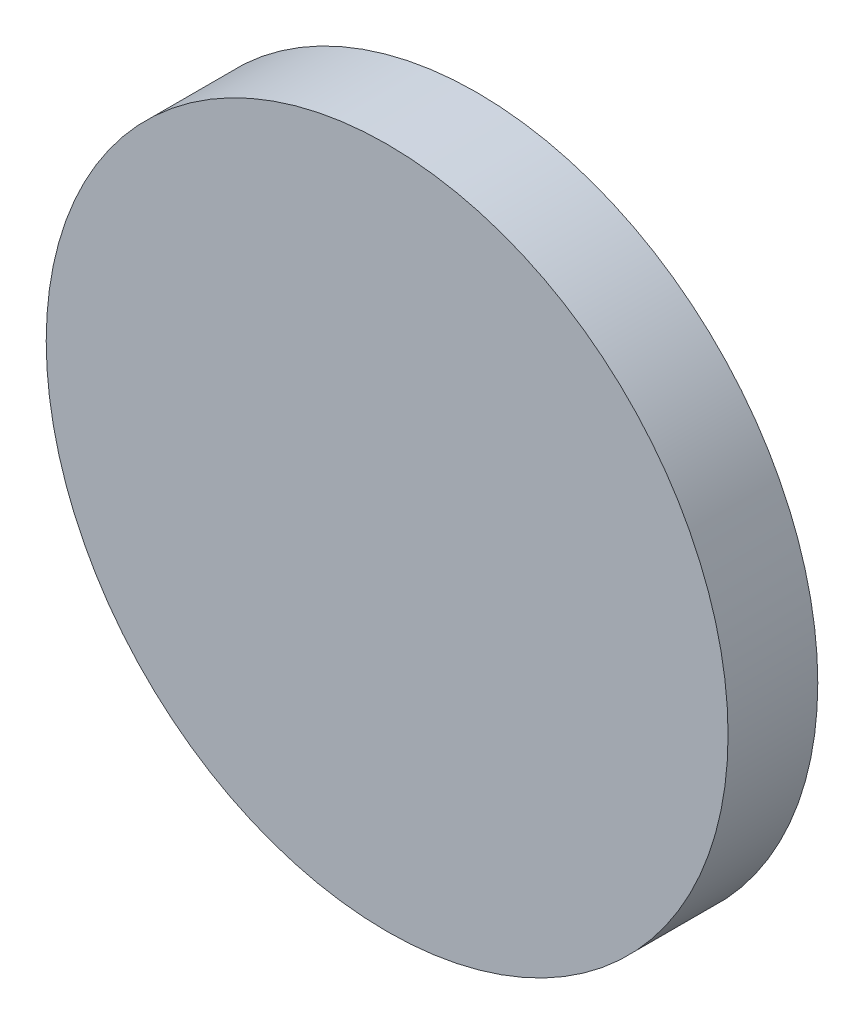
ISO-10303-21;
HEADER;
FILE_DESCRIPTION(('STEP AP214'),'2;1');
FILE_NAME('part.step','',(''),(''),'','','');
FILE_SCHEMA(('AUTOMOTIVE_DESIGN { 1 0 10303 214 1 1 1 1 }'));
ENDSEC;
DATA;
#1=APPLICATION_CONTEXT('core data for automotive mechanical design processes');
#2=APPLICATION_PROTOCOL_DEFINITION('international standard','automotive_design',2000,#1);
#3=PRODUCT_CONTEXT('',#1,'mechanical');
#4=PRODUCT('Part','Part','',(#3));
#5=PRODUCT_RELATED_PRODUCT_CATEGORY('part','',(#4));
#6=PRODUCT_DEFINITION_FORMATION('','',#4);
#7=PRODUCT_DEFINITION_CONTEXT('part definition',#1,'design');
#8=PRODUCT_DEFINITION('design','',#6,#7);
#9=PRODUCT_DEFINITION_SHAPE('','',#8);
#10=(LENGTH_UNIT() NAMED_UNIT(*) SI_UNIT(.MILLI.,.METRE.));
#11=(NAMED_UNIT(*) PLANE_ANGLE_UNIT() SI_UNIT($,.RADIAN.));
#12=(NAMED_UNIT(*) SI_UNIT($,.STERADIAN.) SOLID_ANGLE_UNIT());
#13=UNCERTAINTY_MEASURE_WITH_UNIT(LENGTH_MEASURE(1.E-05),#10,'distance_accuracy_value','');
#14=(GEOMETRIC_REPRESENTATION_CONTEXT(3) GLOBAL_UNCERTAINTY_ASSIGNED_CONTEXT((#13)) GLOBAL_UNIT_ASSIGNED_CONTEXT((#10,
#11,#12)) REPRESENTATION_CONTEXT('',''));
#15=CARTESIAN_POINT('',(0.,0.,0.));
#16=DIRECTION('',(0.,0.,1.));
#17=DIRECTION('',(1.,0.,0.));
#18=AXIS2_PLACEMENT_3D('',#15,#16,#17);
#19=CARTESIAN_POINT('',(0.,0.,5.));
#20=DIRECTION('',(0.,0.,-1.));
#21=DIRECTION('',(-1.,0.,0.));
#22=AXIS2_PLACEMENT_3D('',#19,#20,#21);
#23=CYLINDRICAL_SURFACE('',#22,19.);
#24=CARTESIAN_POINT('',(0.,0.,5.));
#25=DIRECTION('',(0.,0.,1.));
#26=DIRECTION('',(1.,0.,0.));
#27=AXIS2_PLACEMENT_3D('',#24,#25,#26);
#28=CIRCLE('',#27,19.);
#29=CARTESIAN_POINT('',(19.,0.,5.));
#30=VERTEX_POINT('',#29);
#31=EDGE_CURVE('E10',#30,#30,#28,.T.);
#32=ORIENTED_EDGE('',*,*,#31,.F.);
#33=EDGE_LOOP('',(#32));
#34=FACE_BOUND('',#33,.T.);
#35=CARTESIAN_POINT('',(0.,0.,0.));
#36=DIRECTION('',(0.,0.,1.));
#37=DIRECTION('',(1.,0.,0.));
#38=AXIS2_PLACEMENT_3D('',#35,#36,#37);
#39=CIRCLE('',#38,19.);
#40=CARTESIAN_POINT('',(19.,0.,0.));
#41=VERTEX_POINT('',#40);
#42=EDGE_CURVE('E38',#41,#41,#39,.T.);
#43=ORIENTED_EDGE('',*,*,#42,.T.);
#44=EDGE_LOOP('',(#43));
#45=FACE_BOUND('',#44,.T.);
#46=ADVANCED_FACE('F35',(#34,#45),#23,.T.);
#47=CARTESIAN_POINT('',(0.,0.,5.));
#48=DIRECTION('',(0.,0.,1.));
#49=DIRECTION('',(1.,0.,0.));
#50=AXIS2_PLACEMENT_3D('',#47,#48,#49);
#51=PLANE('',#50);
#52=ORIENTED_EDGE('',*,*,#31,.T.);
#53=EDGE_LOOP('',(#52));
#54=FACE_BOUND('',#53,.T.);
#55=ADVANCED_FACE('F65',(#54),#51,.T.);
#56=CARTESIAN_POINT('',(0.,0.,0.));
#57=DIRECTION('',(0.,0.,1.));
#58=DIRECTION('',(1.,0.,0.));
#59=AXIS2_PLACEMENT_3D('',#56,#57,#58);
#60=PLANE('',#59);
#61=CARTESIAN_POINT('',(-14.5,0.,0.));
#62=DIRECTION('',(0.,0.,-1.));
#63=DIRECTION('',(-1.,0.,0.));
#64=AXIS2_PLACEMENT_3D('',#61,#62,#63);
#65=CIRCLE('',#64,2.);
#66=CARTESIAN_POINT('',(-16.5,0.,0.));
#67=VERTEX_POINT('',#66);
#68=EDGE_CURVE('E45',#67,#67,#65,.T.);
#69=ORIENTED_EDGE('',*,*,#68,.F.);
#70=EDGE_LOOP('',(#69));
#71=FACE_BOUND('',#70,.T.);
#72=ORIENTED_EDGE('',*,*,#42,.F.);
#73=EDGE_LOOP('',(#72));
#74=FACE_BOUND('',#73,.T.);
#75=ADVANCED_FACE('F57',(#71,#74),#60,.F.);
#76=CARTESIAN_POINT('',(-14.5,0.,-6.5));
#77=DIRECTION('',(0.,0.,-1.));
#78=DIRECTION('',(-1.,0.,0.));
#79=AXIS2_PLACEMENT_3D('',#76,#77,#78);
#80=CYLINDRICAL_SURFACE('',#79,2.);
#81=ORIENTED_EDGE('',*,*,#68,.T.);
#82=EDGE_LOOP('',(#81));
#83=FACE_BOUND('',#82,.T.);
#84=CARTESIAN_POINT('',(-14.5,0.,-6.5));
#85=DIRECTION('',(0.,0.,-1.));
#86=DIRECTION('',(-1.,0.,0.));
#87=AXIS2_PLACEMENT_3D('',#84,#85,#86);
#88=CIRCLE('',#87,2.);
#89=CARTESIAN_POINT('',(-16.5,0.,-6.5));
#90=VERTEX_POINT('',#89);
#91=EDGE_CURVE('E49',#90,#90,#88,.T.);
#92=ORIENTED_EDGE('',*,*,#91,.F.);
#93=EDGE_LOOP('',(#92));
#94=FACE_BOUND('',#93,.T.);
#95=ADVANCED_FACE('F55',(#83,#94),#80,.T.);
#96=CARTESIAN_POINT('',(-14.5,0.,-6.5));
#97=DIRECTION('',(0.,0.,-1.));
#98=DIRECTION('',(-1.,0.,0.));
#99=AXIS2_PLACEMENT_3D('',#96,#97,#98);
#100=SPHERICAL_SURFACE('',#99,2.);
#101=ORIENTED_EDGE('',*,*,#91,.T.);
#102=EDGE_LOOP('',(#101));
#103=FACE_BOUND('',#102,.T.);
#104=ADVANCED_FACE('F53',(#103),#100,.T.);
#105=CLOSED_SHELL('',(#46,#55,#75,#95,#104));
#106=MANIFOLD_SOLID_BREP('B2',#105);
#107=ADVANCED_BREP_SHAPE_REPRESENTATION('',(#18,#106),#14);
#108=SHAPE_DEFINITION_REPRESENTATION(#9,#107);
ENDSEC;
END-ISO-10303-21;
